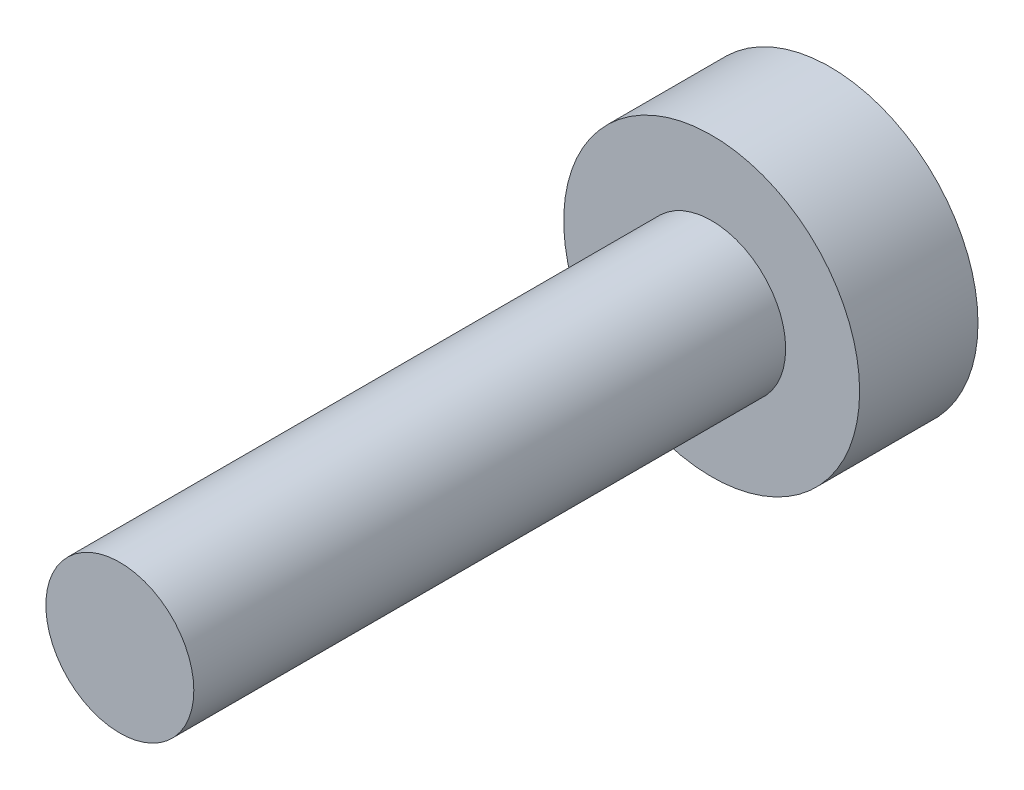
ISO-10303-21;
HEADER;
FILE_DESCRIPTION(('STEP AP214'),'2;1');
FILE_NAME('part.step','',(''),(''),'','','');
FILE_SCHEMA(('AUTOMOTIVE_DESIGN { 1 0 10303 214 1 1 1 1 }'));
ENDSEC;
DATA;
#1=APPLICATION_CONTEXT('core data for automotive mechanical design processes');
#2=APPLICATION_PROTOCOL_DEFINITION('international standard','automotive_design',2000,#1);
#3=PRODUCT_CONTEXT('',#1,'mechanical');
#4=PRODUCT('Part','Part','',(#3));
#5=PRODUCT_RELATED_PRODUCT_CATEGORY('part','',(#4));
#6=PRODUCT_DEFINITION_FORMATION('','',#4);
#7=PRODUCT_DEFINITION_CONTEXT('part definition',#1,'design');
#8=PRODUCT_DEFINITION('design','',#6,#7);
#9=PRODUCT_DEFINITION_SHAPE('','',#8);
#10=(LENGTH_UNIT() NAMED_UNIT(*) SI_UNIT(.MILLI.,.METRE.));
#11=(NAMED_UNIT(*) PLANE_ANGLE_UNIT() SI_UNIT($,.RADIAN.));
#12=(NAMED_UNIT(*) SI_UNIT($,.STERADIAN.) SOLID_ANGLE_UNIT());
#13=UNCERTAINTY_MEASURE_WITH_UNIT(LENGTH_MEASURE(1.E-05),#10,'distance_accuracy_value','');
#14=(GEOMETRIC_REPRESENTATION_CONTEXT(3) GLOBAL_UNCERTAINTY_ASSIGNED_CONTEXT((#13)) GLOBAL_UNIT_ASSIGNED_CONTEXT((#10,
#11,#12)) REPRESENTATION_CONTEXT('',''));
#15=CARTESIAN_POINT('',(0.,0.,0.));
#16=DIRECTION('',(0.,0.,1.));
#17=DIRECTION('',(1.,0.,0.));
#18=AXIS2_PLACEMENT_3D('',#15,#16,#17);
#19=CARTESIAN_POINT('',(0.,0.,10.));
#20=DIRECTION('',(0.,0.,-1.));
#21=DIRECTION('',(-1.,0.,0.));
#22=AXIS2_PLACEMENT_3D('',#19,#20,#21);
#23=CYLINDRICAL_SURFACE('',#22,1.25);
#24=CARTESIAN_POINT('',(0.,0.,10.));
#25=DIRECTION('',(0.,0.,1.));
#26=DIRECTION('',(1.,0.,0.));
#27=AXIS2_PLACEMENT_3D('',#24,#25,#26);
#28=CIRCLE('',#27,1.25);
#29=CARTESIAN_POINT('',(1.25,0.,10.));
#30=VERTEX_POINT('',#29);
#31=EDGE_CURVE('E10',#30,#30,#28,.T.);
#32=ORIENTED_EDGE('',*,*,#31,.F.);
#33=EDGE_LOOP('',(#32));
#34=FACE_BOUND('',#33,.T.);
#35=CARTESIAN_POINT('',(0.,0.,0.));
#36=DIRECTION('',(0.,0.,1.));
#37=DIRECTION('',(1.,0.,0.));
#38=AXIS2_PLACEMENT_3D('',#35,#36,#37);
#39=CIRCLE('',#38,1.25);
#40=CARTESIAN_POINT('',(1.25,0.,0.));
#41=VERTEX_POINT('',#40);
#42=EDGE_CURVE('E36',#41,#41,#39,.T.);
#43=ORIENTED_EDGE('',*,*,#42,.T.);
#44=EDGE_LOOP('',(#43));
#45=FACE_BOUND('',#44,.T.);
#46=ADVANCED_FACE('F33',(#34,#45),#23,.T.);
#47=CARTESIAN_POINT('',(0.,0.,10.));
#48=DIRECTION('',(0.,0.,1.));
#49=DIRECTION('',(1.,0.,0.));
#50=AXIS2_PLACEMENT_3D('',#47,#48,#49);
#51=PLANE('',#50);
#52=ORIENTED_EDGE('',*,*,#31,.T.);
#53=EDGE_LOOP('',(#52));
#54=FACE_BOUND('',#53,.T.);
#55=ADVANCED_FACE('F56',(#54),#51,.T.);
#56=CARTESIAN_POINT('',(0.,0.,0.));
#57=DIRECTION('',(0.,0.,-1.));
#58=DIRECTION('',(-1.,0.,0.));
#59=AXIS2_PLACEMENT_3D('',#56,#57,#58);
#60=CYLINDRICAL_SURFACE('',#59,2.5);
#61=CARTESIAN_POINT('',(0.,0.,0.));
#62=DIRECTION('',(0.,0.,1.));
#63=DIRECTION('',(1.,0.,0.));
#64=AXIS2_PLACEMENT_3D('',#61,#62,#63);
#65=CIRCLE('',#64,2.5);
#66=CARTESIAN_POINT('',(2.5,0.,0.));
#67=VERTEX_POINT('',#66);
#68=EDGE_CURVE('E43',#67,#67,#65,.T.);
#69=ORIENTED_EDGE('',*,*,#68,.F.);
#70=EDGE_LOOP('',(#69));
#71=FACE_BOUND('',#70,.T.);
#72=CARTESIAN_POINT('',(0.,0.,-2.));
#73=DIRECTION('',(0.,0.,1.));
#74=DIRECTION('',(1.,0.,0.));
#75=AXIS2_PLACEMENT_3D('',#72,#73,#74);
#76=CIRCLE('',#75,2.5);
#77=CARTESIAN_POINT('',(2.5,0.,-2.));
#78=VERTEX_POINT('',#77);
#79=EDGE_CURVE('E45',#78,#78,#76,.T.);
#80=ORIENTED_EDGE('',*,*,#79,.T.);
#81=EDGE_LOOP('',(#80));
#82=FACE_BOUND('',#81,.T.);
#83=ADVANCED_FACE('F53',(#71,#82),#60,.T.);
#84=CARTESIAN_POINT('',(0.,0.,0.));
#85=DIRECTION('',(0.,0.,1.));
#86=DIRECTION('',(1.,0.,0.));
#87=AXIS2_PLACEMENT_3D('',#84,#85,#86);
#88=PLANE('',#87);
#89=ORIENTED_EDGE('',*,*,#42,.F.);
#90=EDGE_LOOP('',(#89));
#91=FACE_BOUND('',#90,.T.);
#92=ORIENTED_EDGE('',*,*,#68,.T.);
#93=EDGE_LOOP('',(#92));
#94=FACE_BOUND('',#93,.T.);
#95=ADVANCED_FACE('F51',(#91,#94),#88,.T.);
#96=CARTESIAN_POINT('',(0.,0.,-2.));
#97=DIRECTION('',(0.,0.,1.));
#98=DIRECTION('',(1.,0.,0.));
#99=AXIS2_PLACEMENT_3D('',#96,#97,#98);
#100=PLANE('',#99);
#101=ORIENTED_EDGE('',*,*,#79,.F.);
#102=EDGE_LOOP('',(#101));
#103=FACE_BOUND('',#102,.T.);
#104=ADVANCED_FACE('F60',(#103),#100,.F.);
#105=CLOSED_SHELL('',(#46,#55,#83,#95,#104));
#106=MANIFOLD_SOLID_BREP('B2',#105);
#107=ADVANCED_BREP_SHAPE_REPRESENTATION('',(#18,#106),#14);
#108=SHAPE_DEFINITION_REPRESENTATION(#9,#107);
ENDSEC;
END-ISO-10303-21;
